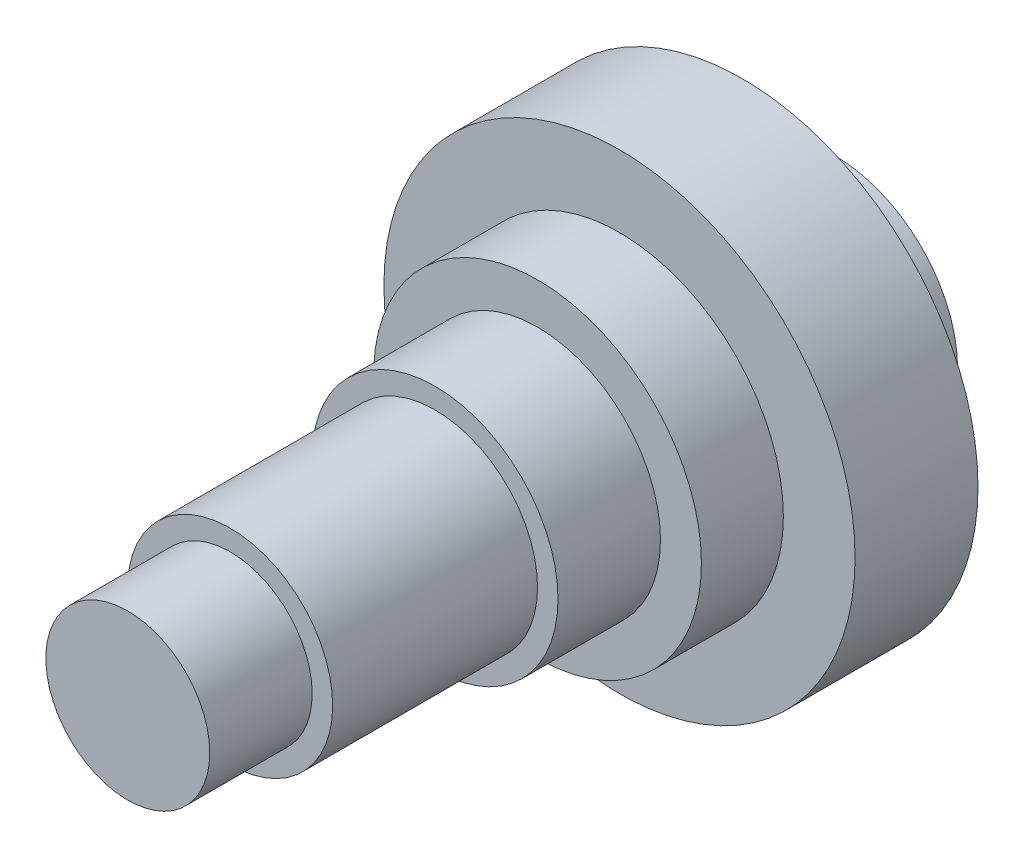
ISO-10303-21;
HEADER;
FILE_DESCRIPTION(('STEP AP214'),'2;1');
FILE_NAME('part.step','',(''),(''),'','','');
FILE_SCHEMA(('AUTOMOTIVE_DESIGN { 1 0 10303 214 1 1 1 1 }'));
ENDSEC;
DATA;
#1=APPLICATION_CONTEXT('core data for automotive mechanical design processes');
#2=APPLICATION_PROTOCOL_DEFINITION('international standard','automotive_design',2000,#1);
#3=PRODUCT_CONTEXT('',#1,'mechanical');
#4=PRODUCT('Part','Part','',(#3));
#5=PRODUCT_RELATED_PRODUCT_CATEGORY('part','',(#4));
#6=PRODUCT_DEFINITION_FORMATION('','',#4);
#7=PRODUCT_DEFINITION_CONTEXT('part definition',#1,'design');
#8=PRODUCT_DEFINITION('design','',#6,#7);
#9=PRODUCT_DEFINITION_SHAPE('','',#8);
#10=(LENGTH_UNIT() NAMED_UNIT(*) SI_UNIT(.MILLI.,.METRE.));
#11=(NAMED_UNIT(*) PLANE_ANGLE_UNIT() SI_UNIT($,.RADIAN.));
#12=(NAMED_UNIT(*) SI_UNIT($,.STERADIAN.) SOLID_ANGLE_UNIT());
#13=UNCERTAINTY_MEASURE_WITH_UNIT(LENGTH_MEASURE(1.E-05),#10,'distance_accuracy_value','');
#14=(GEOMETRIC_REPRESENTATION_CONTEXT(3) GLOBAL_UNCERTAINTY_ASSIGNED_CONTEXT((#13)) GLOBAL_UNIT_ASSIGNED_CONTEXT((#10,
#11,#12)) REPRESENTATION_CONTEXT('',''));
#15=CARTESIAN_POINT('',(0.,0.,0.));
#16=DIRECTION('',(0.,0.,1.));
#17=DIRECTION('',(1.,0.,0.));
#18=AXIS2_PLACEMENT_3D('',#15,#16,#17);
#19=CARTESIAN_POINT('',(0.,0.,-14.3002));
#20=DIRECTION('',(0.,0.,1.));
#21=DIRECTION('',(1.,0.,0.));
#22=AXIS2_PLACEMENT_3D('',#19,#20,#21);
#23=PLANE('',#22);
#24=CARTESIAN_POINT('',(0.,0.,-14.3002));
#25=DIRECTION('',(0.,0.,1.));
#26=DIRECTION('',(1.,0.,0.));
#27=AXIS2_PLACEMENT_3D('',#24,#25,#26);
#28=CIRCLE('',#27,19.05);
#29=CARTESIAN_POINT('',(19.05,0.,-14.3002));
#30=VERTEX_POINT('',#29);
#31=EDGE_CURVE('E10',#30,#30,#28,.T.);
#32=ORIENTED_EDGE('',*,*,#31,.F.);
#33=EDGE_LOOP('',(#32));
#34=FACE_BOUND('',#33,.T.);
#35=ADVANCED_FACE('F33',(#34),#23,.F.);
#36=CARTESIAN_POINT('',(0.,0.,-14.3002));
#37=DIRECTION('',(0.,0.,1.));
#38=DIRECTION('',(1.,0.,0.));
#39=AXIS2_PLACEMENT_3D('',#36,#37,#38);
#40=CYLINDRICAL_SURFACE('',#39,19.05);
#41=CARTESIAN_POINT('',(0.,0.,0.));
#42=DIRECTION('',(0.,0.,1.));
#43=DIRECTION('',(1.,0.,0.));
#44=AXIS2_PLACEMENT_3D('',#41,#42,#43);
#45=CIRCLE('',#44,19.05);
#46=CARTESIAN_POINT('',(19.05,0.,0.));
#47=VERTEX_POINT('',#46);
#48=EDGE_CURVE('E39',#47,#47,#45,.T.);
#49=ORIENTED_EDGE('',*,*,#48,.F.);
#50=EDGE_LOOP('',(#49));
#51=FACE_BOUND('',#50,.T.);
#52=ORIENTED_EDGE('',*,*,#31,.T.);
#53=EDGE_LOOP('',(#52));
#54=FACE_BOUND('',#53,.T.);
#55=ADVANCED_FACE('F135',(#51,#54),#40,.T.);
#56=CARTESIAN_POINT('',(0.,19.05,0.));
#57=DIRECTION('',(0.,0.,1.));
#58=DIRECTION('',(1.,0.,0.));
#59=AXIS2_PLACEMENT_3D('',#56,#57,#58);
#60=PLANE('',#59);
#61=CARTESIAN_POINT('',(0.,0.,0.));
#62=DIRECTION('',(0.,0.,1.));
#63=DIRECTION('',(1.,0.,0.));
#64=AXIS2_PLACEMENT_3D('',#61,#62,#63);
#65=CIRCLE('',#64,36.5125);
#66=CARTESIAN_POINT('',(36.5125,0.,0.));
#67=VERTEX_POINT('',#66);
#68=EDGE_CURVE('E43',#67,#67,#65,.T.);
#69=ORIENTED_EDGE('',*,*,#68,.F.);
#70=EDGE_LOOP('',(#69));
#71=FACE_BOUND('',#70,.T.);
#72=ORIENTED_EDGE('',*,*,#48,.T.);
#73=EDGE_LOOP('',(#72));
#74=FACE_BOUND('',#73,.T.);
#75=ADVANCED_FACE('F130',(#71,#74),#60,.F.);
#76=CARTESIAN_POINT('',(0.,0.,-14.3002));
#77=DIRECTION('',(0.,0.,1.));
#78=DIRECTION('',(1.,0.,0.));
#79=AXIS2_PLACEMENT_3D('',#76,#77,#78);
#80=CYLINDRICAL_SURFACE('',#79,36.5125);
#81=CARTESIAN_POINT('',(0.,0.,19.05));
#82=DIRECTION('',(0.,0.,1.));
#83=DIRECTION('',(1.,0.,0.));
#84=AXIS2_PLACEMENT_3D('',#81,#82,#83);
#85=CIRCLE('',#84,36.5125);
#86=CARTESIAN_POINT('',(36.5125,0.,19.05));
#87=VERTEX_POINT('',#86);
#88=EDGE_CURVE('E47',#87,#87,#85,.T.);
#89=ORIENTED_EDGE('',*,*,#88,.F.);
#90=EDGE_LOOP('',(#89));
#91=FACE_BOUND('',#90,.T.);
#92=ORIENTED_EDGE('',*,*,#68,.T.);
#93=EDGE_LOOP('',(#92));
#94=FACE_BOUND('',#93,.T.);
#95=ADVANCED_FACE('F124',(#91,#94),#80,.T.);
#96=CARTESIAN_POINT('',(0.,36.5125,19.05));
#97=DIRECTION('',(0.,0.,-1.));
#98=DIRECTION('',(-1.,0.,0.));
#99=AXIS2_PLACEMENT_3D('',#96,#97,#98);
#100=PLANE('',#99);
#101=CARTESIAN_POINT('',(0.,0.,19.05));
#102=DIRECTION('',(0.,0.,1.));
#103=DIRECTION('',(1.,0.,0.));
#104=AXIS2_PLACEMENT_3D('',#101,#102,#103);
#105=CIRCLE('',#104,25.4);
#106=CARTESIAN_POINT('',(25.4,0.,19.05));
#107=VERTEX_POINT('',#106);
#108=EDGE_CURVE('E52',#107,#107,#105,.T.);
#109=ORIENTED_EDGE('',*,*,#108,.F.);
#110=EDGE_LOOP('',(#109));
#111=FACE_BOUND('',#110,.T.);
#112=ORIENTED_EDGE('',*,*,#88,.T.);
#113=EDGE_LOOP('',(#112));
#114=FACE_BOUND('',#113,.T.);
#115=ADVANCED_FACE('F118',(#111,#114),#100,.F.);
#116=CARTESIAN_POINT('',(0.,0.,-14.3002));
#117=DIRECTION('',(0.,0.,1.));
#118=DIRECTION('',(1.,0.,0.));
#119=AXIS2_PLACEMENT_3D('',#116,#117,#118);
#120=CYLINDRICAL_SURFACE('',#119,25.4);
#121=CARTESIAN_POINT('',(0.,0.,31.75));
#122=DIRECTION('',(0.,0.,1.));
#123=DIRECTION('',(1.,0.,0.));
#124=AXIS2_PLACEMENT_3D('',#121,#122,#123);
#125=CIRCLE('',#124,25.4);
#126=CARTESIAN_POINT('',(25.4,0.,31.75));
#127=VERTEX_POINT('',#126);
#128=EDGE_CURVE('E55',#127,#127,#125,.T.);
#129=ORIENTED_EDGE('',*,*,#128,.F.);
#130=EDGE_LOOP('',(#129));
#131=FACE_BOUND('',#130,.T.);
#132=ORIENTED_EDGE('',*,*,#108,.T.);
#133=EDGE_LOOP('',(#132));
#134=FACE_BOUND('',#133,.T.);
#135=ADVANCED_FACE('F112',(#131,#134),#120,.T.);
#136=CARTESIAN_POINT('',(0.,25.4,31.75));
#137=DIRECTION('',(0.,0.,-1.));
#138=DIRECTION('',(-1.,0.,0.));
#139=AXIS2_PLACEMENT_3D('',#136,#137,#138);
#140=PLANE('',#139);
#141=CARTESIAN_POINT('',(0.,0.,31.75));
#142=DIRECTION('',(0.,0.,1.));
#143=DIRECTION('',(1.,0.,0.));
#144=AXIS2_PLACEMENT_3D('',#141,#142,#143);
#145=CIRCLE('',#144,19.05);
#146=CARTESIAN_POINT('',(19.05,0.,31.75));
#147=VERTEX_POINT('',#146);
#148=EDGE_CURVE('E58',#147,#147,#145,.T.);
#149=ORIENTED_EDGE('',*,*,#148,.F.);
#150=EDGE_LOOP('',(#149));
#151=FACE_BOUND('',#150,.T.);
#152=ORIENTED_EDGE('',*,*,#128,.T.);
#153=EDGE_LOOP('',(#152));
#154=FACE_BOUND('',#153,.T.);
#155=ADVANCED_FACE('F106',(#151,#154),#140,.F.);
#156=CARTESIAN_POINT('',(0.,0.,-14.3002));
#157=DIRECTION('',(0.,0.,1.));
#158=DIRECTION('',(1.,0.,0.));
#159=AXIS2_PLACEMENT_3D('',#156,#157,#158);
#160=CYLINDRICAL_SURFACE('',#159,19.05);
#161=CARTESIAN_POINT('',(0.,0.,47.625));
#162=DIRECTION('',(0.,0.,1.));
#163=DIRECTION('',(1.,0.,0.));
#164=AXIS2_PLACEMENT_3D('',#161,#162,#163);
#165=CIRCLE('',#164,19.05);
#166=CARTESIAN_POINT('',(19.05,0.,47.625));
#167=VERTEX_POINT('',#166);
#168=EDGE_CURVE('E61',#167,#167,#165,.T.);
#169=ORIENTED_EDGE('',*,*,#168,.F.);
#170=EDGE_LOOP('',(#169));
#171=FACE_BOUND('',#170,.T.);
#172=ORIENTED_EDGE('',*,*,#148,.T.);
#173=EDGE_LOOP('',(#172));
#174=FACE_BOUND('',#173,.T.);
#175=ADVANCED_FACE('F100',(#171,#174),#160,.T.);
#176=CARTESIAN_POINT('',(0.,19.05,47.625));
#177=DIRECTION('',(0.,0.,-1.));
#178=DIRECTION('',(-1.,0.,0.));
#179=AXIS2_PLACEMENT_3D('',#176,#177,#178);
#180=PLANE('',#179);
#181=CARTESIAN_POINT('',(0.,0.,47.625));
#182=DIRECTION('',(0.,0.,1.));
#183=DIRECTION('',(1.,0.,0.));
#184=AXIS2_PLACEMENT_3D('',#181,#182,#183);
#185=CIRCLE('',#184,15.875);
#186=CARTESIAN_POINT('',(15.875,0.,47.625));
#187=VERTEX_POINT('',#186);
#188=EDGE_CURVE('E64',#187,#187,#185,.T.);
#189=ORIENTED_EDGE('',*,*,#188,.F.);
#190=EDGE_LOOP('',(#189));
#191=FACE_BOUND('',#190,.T.);
#192=ORIENTED_EDGE('',*,*,#168,.T.);
#193=EDGE_LOOP('',(#192));
#194=FACE_BOUND('',#193,.T.);
#195=ADVANCED_FACE('F94',(#191,#194),#180,.F.);
#196=CARTESIAN_POINT('',(0.,0.,-14.3002));
#197=DIRECTION('',(0.,0.,1.));
#198=DIRECTION('',(1.,0.,0.));
#199=AXIS2_PLACEMENT_3D('',#196,#197,#198);
#200=CYLINDRICAL_SURFACE('',#199,15.875);
#201=CARTESIAN_POINT('',(0.,0.,79.375));
#202=DIRECTION('',(0.,0.,1.));
#203=DIRECTION('',(1.,0.,0.));
#204=AXIS2_PLACEMENT_3D('',#201,#202,#203);
#205=CIRCLE('',#204,15.875);
#206=CARTESIAN_POINT('',(15.875,0.,79.375));
#207=VERTEX_POINT('',#206);
#208=EDGE_CURVE('E67',#207,#207,#205,.T.);
#209=ORIENTED_EDGE('',*,*,#208,.F.);
#210=EDGE_LOOP('',(#209));
#211=FACE_BOUND('',#210,.T.);
#212=ORIENTED_EDGE('',*,*,#188,.T.);
#213=EDGE_LOOP('',(#212));
#214=FACE_BOUND('',#213,.T.);
#215=ADVANCED_FACE('F88',(#211,#214),#200,.T.);
#216=CARTESIAN_POINT('',(0.,15.875,79.375));
#217=DIRECTION('',(0.,0.,-1.));
#218=DIRECTION('',(-1.,0.,0.));
#219=AXIS2_PLACEMENT_3D('',#216,#217,#218);
#220=PLANE('',#219);
#221=CARTESIAN_POINT('',(0.,0.,79.375));
#222=DIRECTION('',(0.,0.,1.));
#223=DIRECTION('',(1.,0.,0.));
#224=AXIS2_PLACEMENT_3D('',#221,#222,#223);
#225=CIRCLE('',#224,12.7);
#226=CARTESIAN_POINT('',(12.7,0.,79.375));
#227=VERTEX_POINT('',#226);
#228=EDGE_CURVE('E70',#227,#227,#225,.T.);
#229=ORIENTED_EDGE('',*,*,#228,.F.);
#230=EDGE_LOOP('',(#229));
#231=FACE_BOUND('',#230,.T.);
#232=ORIENTED_EDGE('',*,*,#208,.T.);
#233=EDGE_LOOP('',(#232));
#234=FACE_BOUND('',#233,.T.);
#235=ADVANCED_FACE('F82',(#231,#234),#220,.F.);
#236=CARTESIAN_POINT('',(0.,0.,-14.3002));
#237=DIRECTION('',(0.,0.,1.));
#238=DIRECTION('',(1.,0.,0.));
#239=AXIS2_PLACEMENT_3D('',#236,#237,#238);
#240=CYLINDRICAL_SURFACE('',#239,12.7);
#241=CARTESIAN_POINT('',(0.,0.,95.25));
#242=DIRECTION('',(0.,0.,1.));
#243=DIRECTION('',(1.,0.,0.));
#244=AXIS2_PLACEMENT_3D('',#241,#242,#243);
#245=CIRCLE('',#244,12.7);
#246=CARTESIAN_POINT('',(12.7,0.,95.25));
#247=VERTEX_POINT('',#246);
#248=EDGE_CURVE('E73',#247,#247,#245,.T.);
#249=ORIENTED_EDGE('',*,*,#248,.F.);
#250=EDGE_LOOP('',(#249));
#251=FACE_BOUND('',#250,.T.);
#252=ORIENTED_EDGE('',*,*,#228,.T.);
#253=EDGE_LOOP('',(#252));
#254=FACE_BOUND('',#253,.T.);
#255=ADVANCED_FACE('F79',(#251,#254),#240,.T.);
#256=CARTESIAN_POINT('',(0.,12.7,95.25));
#257=DIRECTION('',(0.,0.,-1.));
#258=DIRECTION('',(-1.,0.,0.));
#259=AXIS2_PLACEMENT_3D('',#256,#257,#258);
#260=PLANE('',#259);
#261=ORIENTED_EDGE('',*,*,#248,.T.);
#262=EDGE_LOOP('',(#261));
#263=FACE_BOUND('',#262,.T.);
#264=ADVANCED_FACE('F77',(#263),#260,.F.);
#265=CLOSED_SHELL('',(#35,#55,#75,#95,#115,#135,#155,#175,#195,#215,#235,#255,#264));
#266=MANIFOLD_SOLID_BREP('B2',#265);
#267=ADVANCED_BREP_SHAPE_REPRESENTATION('',(#18,#266),#14);
#268=SHAPE_DEFINITION_REPRESENTATION(#9,#267);
ENDSEC;
END-ISO-10303-21;
